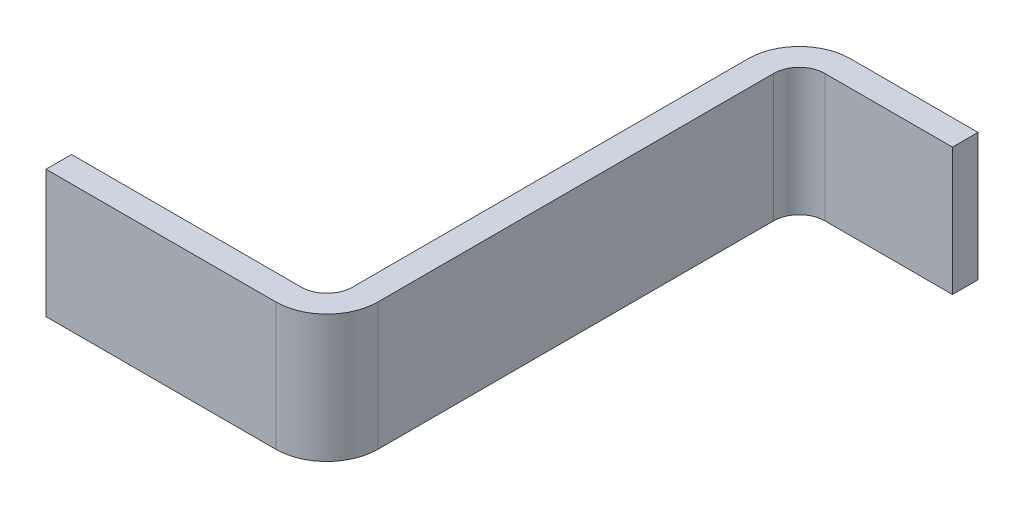
ISO-10303-21;
HEADER;
FILE_DESCRIPTION(('STEP AP214'),'2;1');
FILE_NAME('part.step','',(''),(''),'','','');
FILE_SCHEMA(('AUTOMOTIVE_DESIGN { 1 0 10303 214 1 1 1 1 }'));
ENDSEC;
DATA;
#1=APPLICATION_CONTEXT('core data for automotive mechanical design processes');
#2=APPLICATION_PROTOCOL_DEFINITION('international standard','automotive_design',2000,#1);
#3=PRODUCT_CONTEXT('',#1,'mechanical');
#4=PRODUCT('Part','Part','',(#3));
#5=PRODUCT_RELATED_PRODUCT_CATEGORY('part','',(#4));
#6=PRODUCT_DEFINITION_FORMATION('','',#4);
#7=PRODUCT_DEFINITION_CONTEXT('part definition',#1,'design');
#8=PRODUCT_DEFINITION('design','',#6,#7);
#9=PRODUCT_DEFINITION_SHAPE('','',#8);
#10=(LENGTH_UNIT() NAMED_UNIT(*) SI_UNIT(.MILLI.,.METRE.));
#11=(NAMED_UNIT(*) PLANE_ANGLE_UNIT() SI_UNIT($,.RADIAN.));
#12=(NAMED_UNIT(*) SI_UNIT($,.STERADIAN.) SOLID_ANGLE_UNIT());
#13=UNCERTAINTY_MEASURE_WITH_UNIT(LENGTH_MEASURE(1.E-05),#10,'distance_accuracy_value','');
#14=(GEOMETRIC_REPRESENTATION_CONTEXT(3) GLOBAL_UNCERTAINTY_ASSIGNED_CONTEXT((#13)) GLOBAL_UNIT_ASSIGNED_CONTEXT((#10,
#11,#12)) REPRESENTATION_CONTEXT('',''));
#15=CARTESIAN_POINT('',(0.,0.,0.));
#16=DIRECTION('',(0.,0.,1.));
#17=DIRECTION('',(1.,0.,0.));
#18=AXIS2_PLACEMENT_3D('',#15,#16,#17);
#19=CARTESIAN_POINT('',(0.,0.25,1.95));
#20=DIRECTION('',(0.,0.,-1.));
#21=DIRECTION('',(-1.,0.,0.));
#22=AXIS2_PLACEMENT_3D('',#19,#20,#21);
#23=PLANE('',#22);
#24=DIRECTION('',(1.,0.,0.));
#25=VECTOR('',#24,1.);
#26=CARTESIAN_POINT('',(0.,0.25,1.95));
#27=LINE('',#26,#25);
#28=CARTESIAN_POINT('',(0.9,0.25,1.95));
#29=VERTEX_POINT('',#28);
#30=CARTESIAN_POINT('',(0.,0.25,1.95));
#31=VERTEX_POINT('',#30);
#32=EDGE_CURVE('E85',#29,#31,#27,.F.);
#33=ORIENTED_EDGE('',*,*,#32,.T.);
#34=DIRECTION('',(0.,1.,0.));
#35=VECTOR('',#34,1.);
#36=CARTESIAN_POINT('',(0.,-0.25,1.95));
#37=LINE('',#36,#35);
#38=CARTESIAN_POINT('',(0.,-0.25,1.95));
#39=VERTEX_POINT('',#38);
#40=EDGE_CURVE('E111',#39,#31,#37,.T.);
#41=ORIENTED_EDGE('',*,*,#40,.F.);
#42=DIRECTION('',(1.,0.,0.));
#43=VECTOR('',#42,1.);
#44=CARTESIAN_POINT('',(0.,-0.25,1.95));
#45=LINE('',#44,#43);
#46=CARTESIAN_POINT('',(0.9,-0.25,1.95));
#47=VERTEX_POINT('',#46);
#48=EDGE_CURVE('E130',#39,#47,#45,.T.);
#49=ORIENTED_EDGE('',*,*,#48,.T.);
#50=DIRECTION('',(0.,1.,0.));
#51=VECTOR('',#50,1.);
#52=CARTESIAN_POINT('',(0.9,0.25,1.95));
#53=LINE('',#52,#51);
#54=EDGE_CURVE('E121',#29,#47,#53,.F.);
#55=ORIENTED_EDGE('',*,*,#54,.F.);
#56=EDGE_LOOP('',(#33,#41,#49,#55));
#57=FACE_BOUND('',#56,.T.);
#58=ADVANCED_FACE('F17',(#57),#23,.F.);
#59=CARTESIAN_POINT('',(1.2,0.25,0.1));
#60=DIRECTION('',(0.,0.,-1.));
#61=DIRECTION('',(-1.,0.,0.));
#62=AXIS2_PLACEMENT_3D('',#59,#60,#61);
#63=PLANE('',#62);
#64=DIRECTION('',(1.,0.,0.));
#65=VECTOR('',#64,1.);
#66=CARTESIAN_POINT('',(1.2,0.25,0.1));
#67=LINE('',#66,#65);
#68=CARTESIAN_POINT('',(1.7,0.25,0.1));
#69=VERTEX_POINT('',#68);
#70=CARTESIAN_POINT('',(1.2,0.25,0.1));
#71=VERTEX_POINT('',#70);
#72=EDGE_CURVE('E142',#69,#71,#67,.F.);
#73=ORIENTED_EDGE('',*,*,#72,.T.);
#74=DIRECTION('',(0.,-1.,0.));
#75=VECTOR('',#74,1.);
#76=CARTESIAN_POINT('',(1.2,0.25,0.1));
#77=LINE('',#76,#75);
#78=CARTESIAN_POINT('',(1.2,-0.25,0.1));
#79=VERTEX_POINT('',#78);
#80=EDGE_CURVE('E189',#71,#79,#77,.T.);
#81=ORIENTED_EDGE('',*,*,#80,.T.);
#82=DIRECTION('',(1.,0.,0.));
#83=VECTOR('',#82,1.);
#84=CARTESIAN_POINT('',(1.2,-0.25,0.1));
#85=LINE('',#84,#83);
#86=CARTESIAN_POINT('',(1.7,-0.25,0.1));
#87=VERTEX_POINT('',#86);
#88=EDGE_CURVE('E193',#79,#87,#85,.T.);
#89=ORIENTED_EDGE('',*,*,#88,.T.);
#90=DIRECTION('',(0.,1.,0.));
#91=VECTOR('',#90,1.);
#92=CARTESIAN_POINT('',(1.7,-0.25,0.1));
#93=LINE('',#92,#91);
#94=EDGE_CURVE('E96',#87,#69,#93,.T.);
#95=ORIENTED_EDGE('',*,*,#94,.T.);
#96=EDGE_LOOP('',(#73,#81,#89,#95));
#97=FACE_BOUND('',#96,.T.);
#98=ADVANCED_FACE('F230',(#97),#63,.F.);
#99=CARTESIAN_POINT('',(0.,-0.25,1.85));
#100=DIRECTION('',(-1.,0.,0.));
#101=DIRECTION('',(0.,0.,1.));
#102=AXIS2_PLACEMENT_3D('',#99,#100,#101);
#103=PLANE('',#102);
#104=DIRECTION('',(0.,0.,1.));
#105=VECTOR('',#104,1.);
#106=CARTESIAN_POINT('',(0.,0.25,1.85));
#107=LINE('',#106,#105);
#108=CARTESIAN_POINT('',(0.,0.25,1.85));
#109=VERTEX_POINT('',#108);
#110=EDGE_CURVE('E114',#31,#109,#107,.F.);
#111=ORIENTED_EDGE('',*,*,#110,.T.);
#112=DIRECTION('',(0.,1.,0.));
#113=VECTOR('',#112,1.);
#114=CARTESIAN_POINT('',(0.,-0.25,1.85));
#115=LINE('',#114,#113);
#116=CARTESIAN_POINT('',(0.,-0.25,1.85));
#117=VERTEX_POINT('',#116);
#118=EDGE_CURVE('E175',#109,#117,#115,.F.);
#119=ORIENTED_EDGE('',*,*,#118,.T.);
#120=DIRECTION('',(0.,0.,1.));
#121=VECTOR('',#120,1.);
#122=CARTESIAN_POINT('',(0.,-0.25,1.95));
#123=LINE('',#122,#121);
#124=EDGE_CURVE('E116',#117,#39,#123,.T.);
#125=ORIENTED_EDGE('',*,*,#124,.T.);
#126=ORIENTED_EDGE('',*,*,#40,.T.);
#127=EDGE_LOOP('',(#111,#119,#125,#126));
#128=FACE_BOUND('',#127,.T.);
#129=ADVANCED_FACE('F112',(#128),#103,.T.);
#130=CARTESIAN_POINT('',(0.9,0.25,1.75));
#131=DIRECTION('',(0.,1.,0.));
#132=DIRECTION('',(0.,0.,1.));
#133=AXIS2_PLACEMENT_3D('',#130,#131,#132);
#134=CYLINDRICAL_SURFACE('',#133,0.2);
#135=CARTESIAN_POINT('',(0.9,0.25,1.75));
#136=DIRECTION('',(0.,1.,0.));
#137=DIRECTION('',(0.,0.,1.));
#138=AXIS2_PLACEMENT_3D('',#135,#136,#137);
#139=CIRCLE('',#138,0.2);
#140=CARTESIAN_POINT('',(1.1,0.25,1.75));
#141=VERTEX_POINT('',#140);
#142=EDGE_CURVE('E20',#29,#141,#139,.T.);
#143=ORIENTED_EDGE('',*,*,#142,.F.);
#144=ORIENTED_EDGE('',*,*,#54,.T.);
#145=CARTESIAN_POINT('',(0.9,-0.25,1.75));
#146=DIRECTION('',(0.,1.,0.));
#147=DIRECTION('',(0.,0.,1.));
#148=AXIS2_PLACEMENT_3D('',#145,#146,#147);
#149=CIRCLE('',#148,0.2);
#150=CARTESIAN_POINT('',(1.1,-0.25,1.75));
#151=VERTEX_POINT('',#150);
#152=EDGE_CURVE('E166',#151,#47,#149,.F.);
#153=ORIENTED_EDGE('',*,*,#152,.F.);
#154=DIRECTION('',(0.,1.,0.));
#155=VECTOR('',#154,1.);
#156=CARTESIAN_POINT('',(1.1,0.25,1.75));
#157=LINE('',#156,#155);
#158=EDGE_CURVE('E168',#151,#141,#157,.T.);
#159=ORIENTED_EDGE('',*,*,#158,.T.);
#160=EDGE_LOOP('',(#143,#144,#153,#159));
#161=FACE_BOUND('',#160,.T.);
#162=ADVANCED_FACE('F220',(#161),#134,.T.);
#163=CARTESIAN_POINT('',(1.7,-0.25,0.));
#164=DIRECTION('',(-1.,0.,0.));
#165=DIRECTION('',(0.,0.,1.));
#166=AXIS2_PLACEMENT_3D('',#163,#164,#165);
#167=PLANE('',#166);
#168=DIRECTION('',(0.,0.,1.));
#169=VECTOR('',#168,1.);
#170=CARTESIAN_POINT('',(1.7,0.25,0.));
#171=LINE('',#170,#169);
#172=CARTESIAN_POINT('',(1.7,0.25,0.));
#173=VERTEX_POINT('',#172);
#174=EDGE_CURVE('E141',#69,#173,#171,.F.);
#175=ORIENTED_EDGE('',*,*,#174,.F.);
#176=ORIENTED_EDGE('',*,*,#94,.F.);
#177=DIRECTION('',(0.,0.,1.));
#178=VECTOR('',#177,1.);
#179=CARTESIAN_POINT('',(1.7,-0.25,0.1));
#180=LINE('',#179,#178);
#181=CARTESIAN_POINT('',(1.7,-0.25,0.));
#182=VERTEX_POINT('',#181);
#183=EDGE_CURVE('E192',#87,#182,#180,.F.);
#184=ORIENTED_EDGE('',*,*,#183,.T.);
#185=DIRECTION('',(0.,1.,0.));
#186=VECTOR('',#185,1.);
#187=CARTESIAN_POINT('',(1.7,-0.25,0.));
#188=LINE('',#187,#186);
#189=EDGE_CURVE('E161',#182,#173,#188,.T.);
#190=ORIENTED_EDGE('',*,*,#189,.T.);
#191=EDGE_LOOP('',(#175,#176,#184,#190));
#192=FACE_BOUND('',#191,.T.);
#193=ADVANCED_FACE('F232',(#192),#167,.F.);
#194=CARTESIAN_POINT('',(1.2,0.25,0.2));
#195=DIRECTION('',(0.,-1.,0.));
#196=DIRECTION('',(0.,0.,-1.));
#197=AXIS2_PLACEMENT_3D('',#194,#195,#196);
#198=CYLINDRICAL_SURFACE('',#197,0.1);
#199=CARTESIAN_POINT('',(1.2,0.25,0.2));
#200=DIRECTION('',(0.,-1.,0.));
#201=DIRECTION('',(0.,0.,-1.));
#202=AXIS2_PLACEMENT_3D('',#199,#200,#201);
#203=CIRCLE('',#202,0.1);
#204=CARTESIAN_POINT('',(1.1,0.25,0.2));
#205=VERTEX_POINT('',#204);
#206=EDGE_CURVE('E162',#205,#71,#203,.T.);
#207=ORIENTED_EDGE('',*,*,#206,.F.);
#208=DIRECTION('',(0.,1.,0.));
#209=VECTOR('',#208,1.);
#210=CARTESIAN_POINT('',(1.1,0.25,0.2));
#211=LINE('',#210,#209);
#212=CARTESIAN_POINT('',(1.1,-0.25,0.2));
#213=VERTEX_POINT('',#212);
#214=EDGE_CURVE('E165',#205,#213,#211,.F.);
#215=ORIENTED_EDGE('',*,*,#214,.T.);
#216=CARTESIAN_POINT('',(1.2,-0.25,0.2));
#217=DIRECTION('',(0.,-1.,0.));
#218=DIRECTION('',(0.,0.,-1.));
#219=AXIS2_PLACEMENT_3D('',#216,#217,#218);
#220=CIRCLE('',#219,0.1);
#221=EDGE_CURVE('E159',#79,#213,#220,.F.);
#222=ORIENTED_EDGE('',*,*,#221,.F.);
#223=ORIENTED_EDGE('',*,*,#80,.F.);
#224=EDGE_LOOP('',(#207,#215,#222,#223));
#225=FACE_BOUND('',#224,.T.);
#226=ADVANCED_FACE('F226',(#225),#198,.F.);
#227=CARTESIAN_POINT('',(0.,-0.25,1.85));
#228=DIRECTION('',(0.,0.,1.));
#229=DIRECTION('',(1.,0.,0.));
#230=AXIS2_PLACEMENT_3D('',#227,#228,#229);
#231=PLANE('',#230);
#232=DIRECTION('',(1.,0.,0.));
#233=VECTOR('',#232,1.);
#234=CARTESIAN_POINT('',(0.,-0.25,1.85));
#235=LINE('',#234,#233);
#236=CARTESIAN_POINT('',(0.9,-0.25,1.85));
#237=VERTEX_POINT('',#236);
#238=EDGE_CURVE('E169',#117,#237,#235,.T.);
#239=ORIENTED_EDGE('',*,*,#238,.F.);
#240=ORIENTED_EDGE('',*,*,#118,.F.);
#241=DIRECTION('',(1.,0.,0.));
#242=VECTOR('',#241,1.);
#243=CARTESIAN_POINT('',(0.,0.25,1.85));
#244=LINE('',#243,#242);
#245=CARTESIAN_POINT('',(0.9,0.25,1.85));
#246=VERTEX_POINT('',#245);
#247=EDGE_CURVE('E128',#246,#109,#244,.F.);
#248=ORIENTED_EDGE('',*,*,#247,.F.);
#249=DIRECTION('',(0.,1.,0.));
#250=VECTOR('',#249,1.);
#251=CARTESIAN_POINT('',(0.9,-0.25,1.85));
#252=LINE('',#251,#250);
#253=EDGE_CURVE('E155',#246,#237,#252,.F.);
#254=ORIENTED_EDGE('',*,*,#253,.T.);
#255=EDGE_LOOP('',(#239,#240,#248,#254));
#256=FACE_BOUND('',#255,.T.);
#257=ADVANCED_FACE('F266',(#256),#231,.F.);
#258=CARTESIAN_POINT('',(1.1,0.25,1.75));
#259=DIRECTION('',(-1.,0.,0.));
#260=DIRECTION('',(0.,0.,1.));
#261=AXIS2_PLACEMENT_3D('',#258,#259,#260);
#262=PLANE('',#261);
#263=DIRECTION('',(0.,0.,-1.));
#264=VECTOR('',#263,1.);
#265=CARTESIAN_POINT('',(1.1,0.25,1.75));
#266=LINE('',#265,#264);
#267=EDGE_CURVE('E158',#205,#141,#266,.F.);
#268=ORIENTED_EDGE('',*,*,#267,.T.);
#269=ORIENTED_EDGE('',*,*,#158,.F.);
#270=DIRECTION('',(0.,0.,1.));
#271=VECTOR('',#270,1.);
#272=CARTESIAN_POINT('',(1.1,-0.25,1.75));
#273=LINE('',#272,#271);
#274=EDGE_CURVE('E152',#151,#213,#273,.F.);
#275=ORIENTED_EDGE('',*,*,#274,.T.);
#276=ORIENTED_EDGE('',*,*,#214,.F.);
#277=EDGE_LOOP('',(#268,#269,#275,#276));
#278=FACE_BOUND('',#277,.T.);
#279=ADVANCED_FACE('F268',(#278),#262,.F.);
#280=CARTESIAN_POINT('',(1.2,-0.25,0.));
#281=DIRECTION('',(0.,0.,1.));
#282=DIRECTION('',(1.,0.,0.));
#283=AXIS2_PLACEMENT_3D('',#280,#281,#282);
#284=PLANE('',#283);
#285=DIRECTION('',(1.,0.,0.));
#286=VECTOR('',#285,1.);
#287=CARTESIAN_POINT('',(1.2,-0.25,0.));
#288=LINE('',#287,#286);
#289=CARTESIAN_POINT('',(1.2,-0.25,0.));
#290=VERTEX_POINT('',#289);
#291=EDGE_CURVE('E203',#290,#182,#288,.T.);
#292=ORIENTED_EDGE('',*,*,#291,.F.);
#293=DIRECTION('',(0.,-1.,0.));
#294=VECTOR('',#293,1.);
#295=CARTESIAN_POINT('',(1.2,-0.25,0.));
#296=LINE('',#295,#294);
#297=CARTESIAN_POINT('',(1.2,0.25,0.));
#298=VERTEX_POINT('',#297);
#299=EDGE_CURVE('E149',#298,#290,#296,.T.);
#300=ORIENTED_EDGE('',*,*,#299,.F.);
#301=DIRECTION('',(1.,0.,0.));
#302=VECTOR('',#301,1.);
#303=CARTESIAN_POINT('',(1.2,0.25,0.));
#304=LINE('',#303,#302);
#305=EDGE_CURVE('E164',#173,#298,#304,.F.);
#306=ORIENTED_EDGE('',*,*,#305,.F.);
#307=ORIENTED_EDGE('',*,*,#189,.F.);
#308=EDGE_LOOP('',(#292,#300,#306,#307));
#309=FACE_BOUND('',#308,.T.);
#310=ADVANCED_FACE('F238',(#309),#284,.F.);
#311=CARTESIAN_POINT('',(1.,0.25,1.75));
#312=DIRECTION('',(0.,-1.,0.));
#313=DIRECTION('',(0.,0.,-1.));
#314=AXIS2_PLACEMENT_3D('',#311,#312,#313);
#315=PLANE('',#314);
#316=DIRECTION('',(0.,0.,-1.));
#317=VECTOR('',#316,1.);
#318=CARTESIAN_POINT('',(1.,0.25,1.75));
#319=LINE('',#318,#317);
#320=CARTESIAN_POINT('',(1.,0.25,0.2));
#321=VERTEX_POINT('',#320);
#322=CARTESIAN_POINT('',(1.,0.25,1.75));
#323=VERTEX_POINT('',#322);
#324=EDGE_CURVE('E148',#321,#323,#319,.F.);
#325=ORIENTED_EDGE('',*,*,#324,.T.);
#326=CARTESIAN_POINT('',(0.9,0.25,1.75));
#327=DIRECTION('',(0.,1.,0.));
#328=DIRECTION('',(0.,0.,1.));
#329=AXIS2_PLACEMENT_3D('',#326,#327,#328);
#330=CIRCLE('',#329,0.1);
#331=EDGE_CURVE('E156',#323,#246,#330,.F.);
#332=ORIENTED_EDGE('',*,*,#331,.T.);
#333=ORIENTED_EDGE('',*,*,#247,.T.);
#334=ORIENTED_EDGE('',*,*,#110,.F.);
#335=ORIENTED_EDGE('',*,*,#32,.F.);
#336=ORIENTED_EDGE('',*,*,#142,.T.);
#337=ORIENTED_EDGE('',*,*,#267,.F.);
#338=ORIENTED_EDGE('',*,*,#206,.T.);
#339=ORIENTED_EDGE('',*,*,#72,.F.);
#340=ORIENTED_EDGE('',*,*,#174,.T.);
#341=ORIENTED_EDGE('',*,*,#305,.T.);
#342=CARTESIAN_POINT('',(1.2,0.25,0.2));
#343=DIRECTION('',(0.,-1.,0.));
#344=DIRECTION('',(0.,0.,-1.));
#345=AXIS2_PLACEMENT_3D('',#342,#343,#344);
#346=CIRCLE('',#345,0.2);
#347=EDGE_CURVE('E150',#321,#298,#346,.T.);
#348=ORIENTED_EDGE('',*,*,#347,.F.);
#349=EDGE_LOOP('',(#325,#332,#333,#334,#335,#336,#337,#338,#339,#340,#341,#348));
#350=FACE_BOUND('',#349,.T.);
#351=ADVANCED_FACE('F126',(#350),#315,.F.);
#352=CARTESIAN_POINT('',(0.9,-0.25,1.75));
#353=DIRECTION('',(0.,1.,0.));
#354=DIRECTION('',(0.,0.,1.));
#355=AXIS2_PLACEMENT_3D('',#352,#353,#354);
#356=CYLINDRICAL_SURFACE('',#355,0.1);
#357=CARTESIAN_POINT('',(0.9,-0.25,1.75));
#358=DIRECTION('',(0.,1.,0.));
#359=DIRECTION('',(0.,0.,1.));
#360=AXIS2_PLACEMENT_3D('',#357,#358,#359);
#361=CIRCLE('',#360,0.1);
#362=CARTESIAN_POINT('',(1.,-0.25,1.75));
#363=VERTEX_POINT('',#362);
#364=EDGE_CURVE('E153',#237,#363,#361,.T.);
#365=ORIENTED_EDGE('',*,*,#364,.F.);
#366=ORIENTED_EDGE('',*,*,#253,.F.);
#367=ORIENTED_EDGE('',*,*,#331,.F.);
#368=DIRECTION('',(0.,1.,0.));
#369=VECTOR('',#368,1.);
#370=CARTESIAN_POINT('',(1.,-0.25,1.75));
#371=LINE('',#370,#369);
#372=EDGE_CURVE('E251',#323,#363,#371,.F.);
#373=ORIENTED_EDGE('',*,*,#372,.T.);
#374=EDGE_LOOP('',(#365,#366,#367,#373));
#375=FACE_BOUND('',#374,.T.);
#376=ADVANCED_FACE('F263',(#375),#356,.F.);
#377=CARTESIAN_POINT('',(1.1,-0.25,1.75));
#378=DIRECTION('',(0.,1.,0.));
#379=DIRECTION('',(0.,0.,1.));
#380=AXIS2_PLACEMENT_3D('',#377,#378,#379);
#381=PLANE('',#380);
#382=ORIENTED_EDGE('',*,*,#274,.F.);
#383=ORIENTED_EDGE('',*,*,#152,.T.);
#384=ORIENTED_EDGE('',*,*,#48,.F.);
#385=ORIENTED_EDGE('',*,*,#124,.F.);
#386=ORIENTED_EDGE('',*,*,#238,.T.);
#387=ORIENTED_EDGE('',*,*,#364,.T.);
#388=DIRECTION('',(0.,0.,-1.));
#389=VECTOR('',#388,1.);
#390=CARTESIAN_POINT('',(1.,-0.25,1.75));
#391=LINE('',#390,#389);
#392=CARTESIAN_POINT('',(1.,-0.25,0.2));
#393=VERTEX_POINT('',#392);
#394=EDGE_CURVE('E26',#363,#393,#391,.T.);
#395=ORIENTED_EDGE('',*,*,#394,.T.);
#396=CARTESIAN_POINT('',(1.2,-0.25,0.2));
#397=DIRECTION('',(0.,-1.,0.));
#398=DIRECTION('',(0.,0.,-1.));
#399=AXIS2_PLACEMENT_3D('',#396,#397,#398);
#400=CIRCLE('',#399,0.2);
#401=EDGE_CURVE('E34',#290,#393,#400,.F.);
#402=ORIENTED_EDGE('',*,*,#401,.F.);
#403=ORIENTED_EDGE('',*,*,#291,.T.);
#404=ORIENTED_EDGE('',*,*,#183,.F.);
#405=ORIENTED_EDGE('',*,*,#88,.F.);
#406=ORIENTED_EDGE('',*,*,#221,.T.);
#407=EDGE_LOOP('',(#382,#383,#384,#385,#386,#387,#395,#402,#403,#404,#405,#406));
#408=FACE_BOUND('',#407,.T.);
#409=ADVANCED_FACE('F240',(#408),#381,.F.);
#410=CARTESIAN_POINT('',(1.2,-0.25,0.2));
#411=DIRECTION('',(0.,-1.,0.));
#412=DIRECTION('',(0.,0.,-1.));
#413=AXIS2_PLACEMENT_3D('',#410,#411,#412);
#414=CYLINDRICAL_SURFACE('',#413,0.2);
#415=ORIENTED_EDGE('',*,*,#401,.T.);
#416=DIRECTION('',(0.,1.,0.));
#417=VECTOR('',#416,1.);
#418=CARTESIAN_POINT('',(1.,-0.25,0.2));
#419=LINE('',#418,#417);
#420=EDGE_CURVE('E11',#393,#321,#419,.T.);
#421=ORIENTED_EDGE('',*,*,#420,.T.);
#422=ORIENTED_EDGE('',*,*,#347,.T.);
#423=ORIENTED_EDGE('',*,*,#299,.T.);
#424=EDGE_LOOP('',(#415,#421,#422,#423));
#425=FACE_BOUND('',#424,.T.);
#426=ADVANCED_FACE('F260',(#425),#414,.T.);
#427=CARTESIAN_POINT('',(1.,-0.25,1.75));
#428=DIRECTION('',(1.,0.,0.));
#429=DIRECTION('',(0.,0.,-1.));
#430=AXIS2_PLACEMENT_3D('',#427,#428,#429);
#431=PLANE('',#430);
#432=ORIENTED_EDGE('',*,*,#394,.F.);
#433=ORIENTED_EDGE('',*,*,#372,.F.);
#434=ORIENTED_EDGE('',*,*,#324,.F.);
#435=ORIENTED_EDGE('',*,*,#420,.F.);
#436=EDGE_LOOP('',(#432,#433,#434,#435));
#437=FACE_BOUND('',#436,.T.);
#438=ADVANCED_FACE('F258',(#437),#431,.F.);
#439=CLOSED_SHELL('',(#58,#98,#129,#162,#193,#226,#257,#279,#310,#351,#376,#409,#426,#438));
#440=MANIFOLD_SOLID_BREP('B1',#439);
#441=ADVANCED_BREP_SHAPE_REPRESENTATION('',(#18,#440),#14);
#442=SHAPE_DEFINITION_REPRESENTATION(#9,#441);
ENDSEC;
END-ISO-10303-21;
